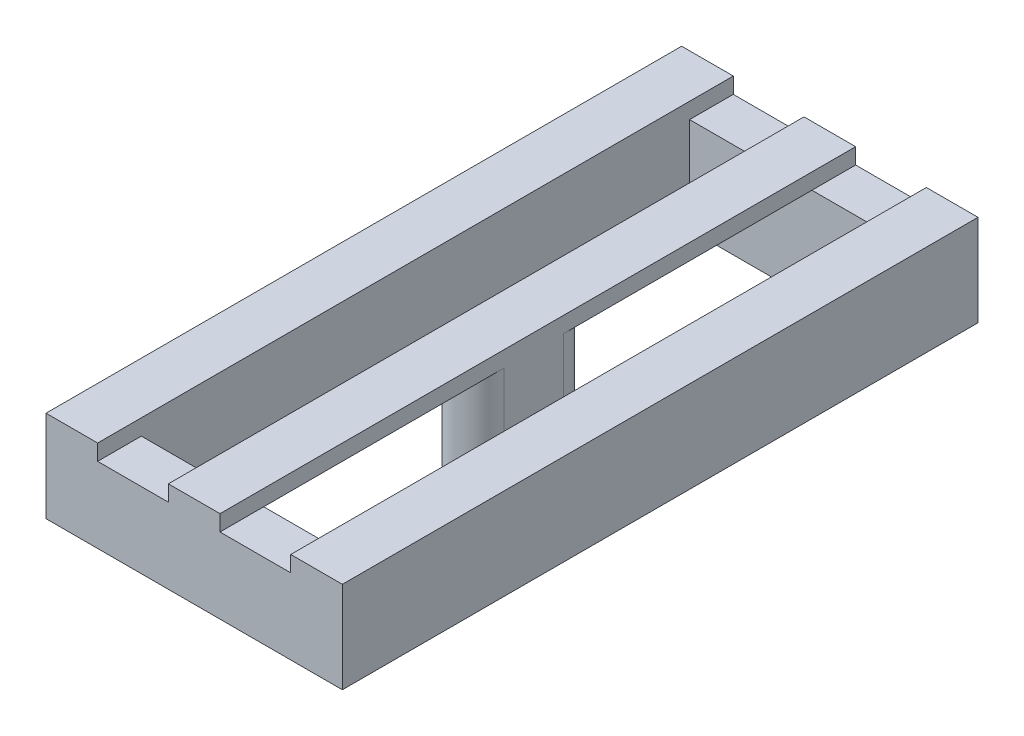
ISO-10303-21;
HEADER;
FILE_DESCRIPTION(('STEP AP214'),'2;1');
FILE_NAME('part.step','',(''),(''),'','','');
FILE_SCHEMA(('AUTOMOTIVE_DESIGN { 1 0 10303 214 1 1 1 1 }'));
ENDSEC;
DATA;
#1=APPLICATION_CONTEXT('core data for automotive mechanical design processes');
#2=APPLICATION_PROTOCOL_DEFINITION('international standard','automotive_design',2000,#1);
#3=PRODUCT_CONTEXT('',#1,'mechanical');
#4=PRODUCT('Part','Part','',(#3));
#5=PRODUCT_RELATED_PRODUCT_CATEGORY('part','',(#4));
#6=PRODUCT_DEFINITION_FORMATION('','',#4);
#7=PRODUCT_DEFINITION_CONTEXT('part definition',#1,'design');
#8=PRODUCT_DEFINITION('design','',#6,#7);
#9=PRODUCT_DEFINITION_SHAPE('','',#8);
#10=(LENGTH_UNIT() NAMED_UNIT(*) SI_UNIT(.MILLI.,.METRE.));
#11=(NAMED_UNIT(*) PLANE_ANGLE_UNIT() SI_UNIT($,.RADIAN.));
#12=(NAMED_UNIT(*) SI_UNIT($,.STERADIAN.) SOLID_ANGLE_UNIT());
#13=UNCERTAINTY_MEASURE_WITH_UNIT(LENGTH_MEASURE(1.E-05),#10,'distance_accuracy_value','');
#14=(GEOMETRIC_REPRESENTATION_CONTEXT(3) GLOBAL_UNCERTAINTY_ASSIGNED_CONTEXT((#13)) GLOBAL_UNIT_ASSIGNED_CONTEXT((#10,
#11,#12)) REPRESENTATION_CONTEXT('',''));
#15=CARTESIAN_POINT('',(0.,0.,0.));
#16=DIRECTION('',(0.,0.,1.));
#17=DIRECTION('',(1.,0.,0.));
#18=AXIS2_PLACEMENT_3D('',#15,#16,#17);
#19=CARTESIAN_POINT('',(0.,-0.6,-7.15));
#20=DIRECTION('',(0.,1.,0.));
#21=DIRECTION('',(-1.,0.,0.));
#22=AXIS2_PLACEMENT_3D('',#19,#20,#21);
#23=CYLINDRICAL_SURFACE('',#22,0.65);
#24=CARTESIAN_POINT('',(0.,1.9,-7.15));
#25=DIRECTION('',(0.,1.,0.));
#26=DIRECTION('',(0.,0.,1.));
#27=AXIS2_PLACEMENT_3D('',#24,#25,#26);
#28=CIRCLE('',#27,0.65);
#29=CARTESIAN_POINT('',(-0.65,1.9,-7.15));
#30=VERTEX_POINT('',#29);
#31=CARTESIAN_POINT('',(0.65,1.9,-7.15));
#32=VERTEX_POINT('',#31);
#33=EDGE_CURVE('E54',#30,#32,#28,.T.);
#34=ORIENTED_EDGE('',*,*,#33,.F.);
#35=DIRECTION('',(0.,1.,0.));
#36=VECTOR('',#35,1.);
#37=CARTESIAN_POINT('',(-0.65,-0.6,-7.15));
#38=LINE('',#37,#36);
#39=CARTESIAN_POINT('',(-0.65,-0.5,-7.15));
#40=VERTEX_POINT('',#39);
#41=EDGE_CURVE('E47',#40,#30,#38,.T.);
#42=ORIENTED_EDGE('',*,*,#41,.F.);
#43=CARTESIAN_POINT('',(0.,-0.5,-7.15));
#44=DIRECTION('',(0.,-1.,0.));
#45=DIRECTION('',(1.,0.,0.));
#46=AXIS2_PLACEMENT_3D('',#43,#44,#45);
#47=CIRCLE('',#46,0.65);
#48=CARTESIAN_POINT('',(0.65,-0.5,-7.15));
#49=VERTEX_POINT('',#48);
#50=EDGE_CURVE('E457',#49,#40,#47,.T.);
#51=ORIENTED_EDGE('',*,*,#50,.F.);
#52=DIRECTION('',(0.,1.,0.));
#53=VECTOR('',#52,1.);
#54=CARTESIAN_POINT('',(0.65,-0.6,-7.15));
#55=LINE('',#54,#53);
#56=EDGE_CURVE('E11',#49,#32,#55,.T.);
#57=ORIENTED_EDGE('',*,*,#56,.T.);
#58=EDGE_LOOP('',(#34,#42,#51,#57));
#59=FACE_BOUND('',#58,.T.);
#60=ADVANCED_FACE('F38',(#59),#23,.T.);
#61=CARTESIAN_POINT('',(0.,-0.6,-8.65));
#62=DIRECTION('',(0.,1.,0.));
#63=DIRECTION('',(-1.,0.,0.));
#64=AXIS2_PLACEMENT_3D('',#61,#62,#63);
#65=CYLINDRICAL_SURFACE('',#64,0.65);
#66=DIRECTION('',(0.,1.,0.));
#67=VECTOR('',#66,1.);
#68=CARTESIAN_POINT('',(-0.65,-0.6,-8.65));
#69=LINE('',#68,#67);
#70=CARTESIAN_POINT('',(-0.65,-0.5,-8.65));
#71=VERTEX_POINT('',#70);
#72=CARTESIAN_POINT('',(-0.65,1.9,-8.65));
#73=VERTEX_POINT('',#72);
#74=EDGE_CURVE('E467',#71,#73,#69,.T.);
#75=ORIENTED_EDGE('',*,*,#74,.T.);
#76=CARTESIAN_POINT('',(0.,1.9,-8.65));
#77=DIRECTION('',(0.,1.,0.));
#78=DIRECTION('',(0.,0.,1.));
#79=AXIS2_PLACEMENT_3D('',#76,#77,#78);
#80=CIRCLE('',#79,0.65);
#81=CARTESIAN_POINT('',(0.65,1.9,-8.65));
#82=VERTEX_POINT('',#81);
#83=EDGE_CURVE('E448',#73,#82,#80,.F.);
#84=ORIENTED_EDGE('',*,*,#83,.T.);
#85=DIRECTION('',(0.,1.,0.));
#86=VECTOR('',#85,1.);
#87=CARTESIAN_POINT('',(0.65,-0.6,-8.65));
#88=LINE('',#87,#86);
#89=CARTESIAN_POINT('',(0.65,-0.5,-8.65));
#90=VERTEX_POINT('',#89);
#91=EDGE_CURVE('E42',#90,#82,#88,.T.);
#92=ORIENTED_EDGE('',*,*,#91,.F.);
#93=CARTESIAN_POINT('',(0.,-0.5,-8.65));
#94=DIRECTION('',(0.,1.,0.));
#95=DIRECTION('',(1.,0.,0.));
#96=AXIS2_PLACEMENT_3D('',#93,#94,#95);
#97=CIRCLE('',#96,0.65);
#98=EDGE_CURVE('E460',#90,#71,#97,.T.);
#99=ORIENTED_EDGE('',*,*,#98,.T.);
#100=EDGE_LOOP('',(#75,#84,#92,#99));
#101=FACE_BOUND('',#100,.T.);
#102=ADVANCED_FACE('F477',(#101),#65,.T.);
#103=CARTESIAN_POINT('',(0.,-0.5,0.));
#104=DIRECTION('',(0.,1.,0.));
#105=DIRECTION('',(-1.,0.,0.));
#106=AXIS2_PLACEMENT_3D('',#103,#104,#105);
#107=PLANE('',#106);
#108=ORIENTED_EDGE('',*,*,#50,.T.);
#109=DIRECTION('',(0.,0.,-1.));
#110=VECTOR('',#109,1.);
#111=CARTESIAN_POINT('',(-0.65,-0.5,0.));
#112=LINE('',#111,#110);
#113=EDGE_CURVE('E465',#40,#71,#112,.T.);
#114=ORIENTED_EDGE('',*,*,#113,.T.);
#115=ORIENTED_EDGE('',*,*,#98,.F.);
#116=DIRECTION('',(0.,0.,-1.));
#117=VECTOR('',#116,1.);
#118=CARTESIAN_POINT('',(0.65,-0.5,0.));
#119=LINE('',#118,#117);
#120=EDGE_CURVE('E463',#49,#90,#119,.T.);
#121=ORIENTED_EDGE('',*,*,#120,.F.);
#122=EDGE_LOOP('',(#108,#114,#115,#121));
#123=FACE_BOUND('',#122,.T.);
#124=ADVANCED_FACE('F479',(#123),#107,.F.);
#125=CARTESIAN_POINT('',(-0.650000000000001,3.1,-16.));
#126=DIRECTION('',(-1.,0.,0.));
#127=DIRECTION('',(0.,-1.,0.));
#128=AXIS2_PLACEMENT_3D('',#125,#126,#127);
#129=PLANE('',#128);
#130=DIRECTION('',(0.,0.,1.));
#131=VECTOR('',#130,1.);
#132=CARTESIAN_POINT('',(-0.65,2.3,-16.));
#133=LINE('',#132,#131);
#134=CARTESIAN_POINT('',(-0.650000000000001,2.3,-16.));
#135=VERTEX_POINT('',#134);
#136=CARTESIAN_POINT('',(-0.65,2.3,0.));
#137=VERTEX_POINT('',#136);
#138=EDGE_CURVE('E257',#135,#137,#133,.T.);
#139=ORIENTED_EDGE('',*,*,#138,.F.);
#140=DIRECTION('',(0.,-1.,0.));
#141=VECTOR('',#140,1.);
#142=CARTESIAN_POINT('',(-0.650000000000001,3.1,-16.));
#143=LINE('',#142,#141);
#144=CARTESIAN_POINT('',(-0.65,1.9,-16.));
#145=VERTEX_POINT('',#144);
#146=EDGE_CURVE('E316',#135,#145,#143,.T.);
#147=ORIENTED_EDGE('',*,*,#146,.T.);
#148=DIRECTION('',(0.,0.,1.));
#149=VECTOR('',#148,1.);
#150=CARTESIAN_POINT('',(-0.65,1.9,-16.));
#151=LINE('',#150,#149);
#152=CARTESIAN_POINT('',(-0.65,1.9,-14.9));
#153=VERTEX_POINT('',#152);
#154=EDGE_CURVE('E318',#145,#153,#151,.T.);
#155=ORIENTED_EDGE('',*,*,#154,.T.);
#156=DIRECTION('',(0.,0.,1.));
#157=VECTOR('',#156,1.);
#158=CARTESIAN_POINT('',(-0.65,1.9,-16.2601470508735));
#159=LINE('',#158,#157);
#160=EDGE_CURVE('E449',#153,#73,#159,.T.);
#161=ORIENTED_EDGE('',*,*,#160,.T.);
#162=ORIENTED_EDGE('',*,*,#74,.F.);
#163=ORIENTED_EDGE('',*,*,#113,.F.);
#164=ORIENTED_EDGE('',*,*,#41,.T.);
#165=CARTESIAN_POINT('',(-0.65,1.9,-1.1));
#166=VERTEX_POINT('',#165);
#167=EDGE_CURVE('E443',#30,#166,#159,.T.);
#168=ORIENTED_EDGE('',*,*,#167,.T.);
#169=CARTESIAN_POINT('',(-0.65,1.9,0.));
#170=VERTEX_POINT('',#169);
#171=EDGE_CURVE('E285',#166,#170,#151,.T.);
#172=ORIENTED_EDGE('',*,*,#171,.T.);
#173=DIRECTION('',(0.,-1.,0.));
#174=VECTOR('',#173,1.);
#175=CARTESIAN_POINT('',(-0.650000000000001,3.1,0.));
#176=LINE('',#175,#174);
#177=EDGE_CURVE('E273',#137,#170,#176,.T.);
#178=ORIENTED_EDGE('',*,*,#177,.F.);
#179=EDGE_LOOP('',(#139,#147,#155,#161,#162,#163,#164,#168,#172,#178));
#180=FACE_BOUND('',#179,.T.);
#181=ADVANCED_FACE('F282',(#180),#129,.T.);
#182=CARTESIAN_POINT('',(0.65,1.9,-16.));
#183=DIRECTION('',(1.,0.,0.));
#184=DIRECTION('',(0.,0.,-1.));
#185=AXIS2_PLACEMENT_3D('',#182,#183,#184);
#186=PLANE('',#185);
#187=DIRECTION('',(0.,0.,-1.));
#188=VECTOR('',#187,1.);
#189=CARTESIAN_POINT('',(0.65,2.3,-16.));
#190=LINE('',#189,#188);
#191=CARTESIAN_POINT('',(0.649999999999998,2.3,0.));
#192=VERTEX_POINT('',#191);
#193=CARTESIAN_POINT('',(0.649999999999998,2.3,-16.));
#194=VERTEX_POINT('',#193);
#195=EDGE_CURVE('E267',#192,#194,#190,.T.);
#196=ORIENTED_EDGE('',*,*,#195,.F.);
#197=DIRECTION('',(0.,1.,0.));
#198=VECTOR('',#197,1.);
#199=CARTESIAN_POINT('',(0.65,1.9,0.));
#200=LINE('',#199,#198);
#201=CARTESIAN_POINT('',(0.65,1.9,0.));
#202=VERTEX_POINT('',#201);
#203=EDGE_CURVE('E277',#202,#192,#200,.T.);
#204=ORIENTED_EDGE('',*,*,#203,.F.);
#205=DIRECTION('',(0.,0.,1.));
#206=VECTOR('',#205,1.);
#207=CARTESIAN_POINT('',(0.65,1.9,-16.));
#208=LINE('',#207,#206);
#209=CARTESIAN_POINT('',(0.65,1.9,-1.1));
#210=VERTEX_POINT('',#209);
#211=EDGE_CURVE('E343',#210,#202,#208,.T.);
#212=ORIENTED_EDGE('',*,*,#211,.F.);
#213=DIRECTION('',(0.,0.,1.));
#214=VECTOR('',#213,1.);
#215=CARTESIAN_POINT('',(0.65,1.9,-16.2601470508735));
#216=LINE('',#215,#214);
#217=EDGE_CURVE('E437',#32,#210,#216,.T.);
#218=ORIENTED_EDGE('',*,*,#217,.F.);
#219=ORIENTED_EDGE('',*,*,#56,.F.);
#220=ORIENTED_EDGE('',*,*,#120,.T.);
#221=ORIENTED_EDGE('',*,*,#91,.T.);
#222=CARTESIAN_POINT('',(0.65,1.9,-14.9));
#223=VERTEX_POINT('',#222);
#224=EDGE_CURVE('E444',#223,#82,#216,.T.);
#225=ORIENTED_EDGE('',*,*,#224,.F.);
#226=CARTESIAN_POINT('',(0.65,1.9,-16.));
#227=VERTEX_POINT('',#226);
#228=EDGE_CURVE('E326',#227,#223,#208,.T.);
#229=ORIENTED_EDGE('',*,*,#228,.F.);
#230=DIRECTION('',(0.,1.,0.));
#231=VECTOR('',#230,1.);
#232=CARTESIAN_POINT('',(0.65,1.9,-16.));
#233=LINE('',#232,#231);
#234=EDGE_CURVE('E319',#227,#194,#233,.T.);
#235=ORIENTED_EDGE('',*,*,#234,.T.);
#236=EDGE_LOOP('',(#196,#204,#212,#218,#219,#220,#221,#225,#229,#235));
#237=FACE_BOUND('',#236,.T.);
#238=ADVANCED_FACE('F40',(#237),#186,.T.);
#239=CARTESIAN_POINT('',(-3.73,2.3,-16.));
#240=DIRECTION('',(0.,-1.,0.));
#241=DIRECTION('',(0.,0.,-1.));
#242=AXIS2_PLACEMENT_3D('',#239,#240,#241);
#243=PLANE('',#242);
#244=ORIENTED_EDGE('',*,*,#195,.T.);
#245=DIRECTION('',(1.,0.,0.));
#246=VECTOR('',#245,1.);
#247=CARTESIAN_POINT('',(-3.73,2.3,-16.));
#248=LINE('',#247,#246);
#249=EDGE_CURVE('E263',#135,#194,#248,.T.);
#250=ORIENTED_EDGE('',*,*,#249,.F.);
#251=ORIENTED_EDGE('',*,*,#138,.T.);
#252=DIRECTION('',(1.,0.,0.));
#253=VECTOR('',#252,1.);
#254=CARTESIAN_POINT('',(-3.73,2.3,0.));
#255=LINE('',#254,#253);
#256=EDGE_CURVE('E260',#137,#192,#255,.T.);
#257=ORIENTED_EDGE('',*,*,#256,.T.);
#258=EDGE_LOOP('',(#244,#250,#251,#257));
#259=FACE_BOUND('',#258,.T.);
#260=ADVANCED_FACE('F259',(#259),#243,.F.);
#261=CARTESIAN_POINT('',(-0.65,1.9,-16.2601470508735));
#262=DIRECTION('',(0.,1.,0.));
#263=DIRECTION('',(0.,0.,1.));
#264=AXIS2_PLACEMENT_3D('',#261,#262,#263);
#265=PLANE('',#264);
#266=ORIENTED_EDGE('',*,*,#83,.F.);
#267=ORIENTED_EDGE('',*,*,#160,.F.);
#268=DIRECTION('',(-1.,0.,0.));
#269=VECTOR('',#268,1.);
#270=CARTESIAN_POINT('',(-0.65,1.9,-14.9));
#271=LINE('',#270,#269);
#272=EDGE_CURVE('E445',#223,#153,#271,.T.);
#273=ORIENTED_EDGE('',*,*,#272,.F.);
#274=ORIENTED_EDGE('',*,*,#224,.T.);
#275=EDGE_LOOP('',(#266,#267,#273,#274));
#276=FACE_BOUND('',#275,.T.);
#277=ADVANCED_FACE('F484',(#276),#265,.F.);
#278=ORIENTED_EDGE('',*,*,#167,.F.);
#279=ORIENTED_EDGE('',*,*,#33,.T.);
#280=ORIENTED_EDGE('',*,*,#217,.T.);
#281=DIRECTION('',(-1.,0.,0.));
#282=VECTOR('',#281,1.);
#283=CARTESIAN_POINT('',(-0.65,1.9,-1.1));
#284=LINE('',#283,#282);
#285=EDGE_CURVE('E440',#210,#166,#284,.T.);
#286=ORIENTED_EDGE('',*,*,#285,.T.);
#287=EDGE_LOOP('',(#278,#279,#280,#286));
#288=FACE_BOUND('',#287,.T.);
#289=ADVANCED_FACE('F550',(#288),#265,.F.);
#290=CARTESIAN_POINT('',(2.43,0.,-14.9));
#291=DIRECTION('',(0.,0.,-1.));
#292=DIRECTION('',(-1.,0.,0.));
#293=AXIS2_PLACEMENT_3D('',#290,#291,#292);
#294=PLANE('',#293);
#295=DIRECTION('',(-1.,0.,0.));
#296=VECTOR('',#295,1.);
#297=CARTESIAN_POINT('',(2.43,1.9,-14.9));
#298=LINE('',#297,#296);
#299=CARTESIAN_POINT('',(2.43,1.9,-14.9));
#300=VERTEX_POINT('',#299);
#301=EDGE_CURVE('E351',#300,#223,#298,.T.);
#302=ORIENTED_EDGE('',*,*,#301,.T.);
#303=ORIENTED_EDGE('',*,*,#272,.T.);
#304=DIRECTION('',(1.,0.,0.));
#305=VECTOR('',#304,1.);
#306=CARTESIAN_POINT('',(-2.43,1.9,-14.9));
#307=LINE('',#306,#305);
#308=CARTESIAN_POINT('',(-2.43,1.9,-14.9));
#309=VERTEX_POINT('',#308);
#310=EDGE_CURVE('E315',#309,#153,#307,.T.);
#311=ORIENTED_EDGE('',*,*,#310,.F.);
#312=DIRECTION('',(0.,1.,0.));
#313=VECTOR('',#312,1.);
#314=CARTESIAN_POINT('',(-2.43,0.,-14.9));
#315=LINE('',#314,#313);
#316=CARTESIAN_POINT('',(-2.43,-0.5,-14.9));
#317=VERTEX_POINT('',#316);
#318=EDGE_CURVE('E310',#317,#309,#315,.T.);
#319=ORIENTED_EDGE('',*,*,#318,.F.);
#320=DIRECTION('',(-1.,0.,0.));
#321=VECTOR('',#320,1.);
#322=CARTESIAN_POINT('',(0.,-0.5,-14.9));
#323=LINE('',#322,#321);
#324=CARTESIAN_POINT('',(2.43,-0.5,-14.9));
#325=VERTEX_POINT('',#324);
#326=EDGE_CURVE('E426',#325,#317,#323,.T.);
#327=ORIENTED_EDGE('',*,*,#326,.F.);
#328=DIRECTION('',(0.,1.,0.));
#329=VECTOR('',#328,1.);
#330=CARTESIAN_POINT('',(2.43,0.,-14.9));
#331=LINE('',#330,#329);
#332=EDGE_CURVE('E349',#325,#300,#331,.T.);
#333=ORIENTED_EDGE('',*,*,#332,.T.);
#334=EDGE_LOOP('',(#302,#303,#311,#319,#327,#333));
#335=FACE_BOUND('',#334,.T.);
#336=ADVANCED_FACE('F487',(#335),#294,.F.);
#337=CARTESIAN_POINT('',(0.65,0.,-1.1));
#338=DIRECTION('',(0.,0.,1.));
#339=DIRECTION('',(1.,0.,0.));
#340=AXIS2_PLACEMENT_3D('',#337,#338,#339);
#341=PLANE('',#340);
#342=DIRECTION('',(-1.,0.,0.));
#343=VECTOR('',#342,1.);
#344=CARTESIAN_POINT('',(-0.649999999999999,1.9,-1.1));
#345=LINE('',#344,#343);
#346=CARTESIAN_POINT('',(-2.43,1.9,-1.1));
#347=VERTEX_POINT('',#346);
#348=EDGE_CURVE('E362',#166,#347,#345,.T.);
#349=ORIENTED_EDGE('',*,*,#348,.F.);
#350=ORIENTED_EDGE('',*,*,#285,.F.);
#351=DIRECTION('',(1.,0.,0.));
#352=VECTOR('',#351,1.);
#353=CARTESIAN_POINT('',(0.649999999999999,1.9,-1.1));
#354=LINE('',#353,#352);
#355=CARTESIAN_POINT('',(2.43,1.9,-1.1));
#356=VERTEX_POINT('',#355);
#357=EDGE_CURVE('E355',#210,#356,#354,.T.);
#358=ORIENTED_EDGE('',*,*,#357,.T.);
#359=DIRECTION('',(0.,1.,0.));
#360=VECTOR('',#359,1.);
#361=CARTESIAN_POINT('',(2.43,0.,-1.1));
#362=LINE('',#361,#360);
#363=CARTESIAN_POINT('',(2.43,-0.5,-1.1));
#364=VERTEX_POINT('',#363);
#365=EDGE_CURVE('E344',#364,#356,#362,.T.);
#366=ORIENTED_EDGE('',*,*,#365,.F.);
#367=DIRECTION('',(-1.,0.,0.));
#368=VECTOR('',#367,1.);
#369=CARTESIAN_POINT('',(0.,-0.5,-1.1));
#370=LINE('',#369,#368);
#371=CARTESIAN_POINT('',(0.65,-0.5,-1.1));
#372=VERTEX_POINT('',#371);
#373=EDGE_CURVE('E357',#364,#372,#370,.T.);
#374=ORIENTED_EDGE('',*,*,#373,.T.);
#375=DIRECTION('',(0.,1.,0.));
#376=VECTOR('',#375,1.);
#377=CARTESIAN_POINT('',(0.65,-0.600000000000001,-1.1));
#378=LINE('',#377,#376);
#379=CARTESIAN_POINT('',(0.65,0.5,-1.1));
#380=VERTEX_POINT('',#379);
#381=EDGE_CURVE('E363',#372,#380,#378,.T.);
#382=ORIENTED_EDGE('',*,*,#381,.T.);
#383=DIRECTION('',(1.,0.,0.));
#384=VECTOR('',#383,1.);
#385=CARTESIAN_POINT('',(0.65,0.5,-1.1));
#386=LINE('',#385,#384);
#387=CARTESIAN_POINT('',(-0.65,0.5,-1.1));
#388=VERTEX_POINT('',#387);
#389=EDGE_CURVE('E407',#388,#380,#386,.T.);
#390=ORIENTED_EDGE('',*,*,#389,.F.);
#391=DIRECTION('',(0.,1.,0.));
#392=VECTOR('',#391,1.);
#393=CARTESIAN_POINT('',(-0.65,-0.600000000000001,-1.1));
#394=LINE('',#393,#392);
#395=CARTESIAN_POINT('',(-0.65,-0.5,-1.1));
#396=VERTEX_POINT('',#395);
#397=EDGE_CURVE('E402',#396,#388,#394,.T.);
#398=ORIENTED_EDGE('',*,*,#397,.F.);
#399=DIRECTION('',(1.,0.,0.));
#400=VECTOR('',#399,1.);
#401=CARTESIAN_POINT('',(0.,-0.5,-1.1));
#402=LINE('',#401,#400);
#403=CARTESIAN_POINT('',(-2.43,-0.5,-1.1));
#404=VERTEX_POINT('',#403);
#405=EDGE_CURVE('E358',#404,#396,#402,.T.);
#406=ORIENTED_EDGE('',*,*,#405,.F.);
#407=DIRECTION('',(0.,1.,0.));
#408=VECTOR('',#407,1.);
#409=CARTESIAN_POINT('',(-2.43,0.,-1.1));
#410=LINE('',#409,#408);
#411=EDGE_CURVE('E360',#404,#347,#410,.T.);
#412=ORIENTED_EDGE('',*,*,#411,.T.);
#413=EDGE_LOOP('',(#349,#350,#358,#366,#374,#382,#390,#398,#406,#412));
#414=FACE_BOUND('',#413,.T.);
#415=ADVANCED_FACE('F547',(#414),#341,.F.);
#416=CARTESIAN_POINT('',(0.,-0.5,0.));
#417=DIRECTION('',(0.,1.,0.));
#418=DIRECTION('',(-1.,0.,0.));
#419=AXIS2_PLACEMENT_3D('',#416,#417,#418);
#420=PLANE('',#419);
#421=DIRECTION('',(-1.,0.,0.));
#422=VECTOR('',#421,1.);
#423=CARTESIAN_POINT('',(-3.23,-0.500000000000001,-0.5));
#424=LINE('',#423,#422);
#425=CARTESIAN_POINT('',(2.93,-0.499999999999999,-0.5));
#426=VERTEX_POINT('',#425);
#427=CARTESIAN_POINT('',(-2.93,-0.5,-0.5));
#428=VERTEX_POINT('',#427);
#429=EDGE_CURVE('E322',#426,#428,#424,.T.);
#430=ORIENTED_EDGE('',*,*,#429,.T.);
#431=CARTESIAN_POINT('',(-2.93,-0.500000000000001,-0.8));
#432=DIRECTION('',(0.,1.,0.));
#433=DIRECTION('',(-1.,0.,0.));
#434=AXIS2_PLACEMENT_3D('',#431,#432,#433);
#435=CIRCLE('',#434,0.3);
#436=CARTESIAN_POINT('',(-3.23,-0.500000000000001,-0.8));
#437=VERTEX_POINT('',#436);
#438=EDGE_CURVE('E399',#428,#437,#435,.F.);
#439=ORIENTED_EDGE('',*,*,#438,.T.);
#440=DIRECTION('',(0.,0.,-1.));
#441=VECTOR('',#440,1.);
#442=CARTESIAN_POINT('',(-3.23,-0.500000000000001,-15.5));
#443=LINE('',#442,#441);
#444=CARTESIAN_POINT('',(-3.23,-0.500000000000001,-15.2));
#445=VERTEX_POINT('',#444);
#446=EDGE_CURVE('E396',#437,#445,#443,.T.);
#447=ORIENTED_EDGE('',*,*,#446,.T.);
#448=CARTESIAN_POINT('',(-2.93,-0.500000000000001,-15.2));
#449=DIRECTION('',(0.,1.,0.));
#450=DIRECTION('',(-1.,0.,0.));
#451=AXIS2_PLACEMENT_3D('',#448,#449,#450);
#452=CIRCLE('',#451,0.3);
#453=CARTESIAN_POINT('',(-2.93,-0.500000000000001,-15.5));
#454=VERTEX_POINT('',#453);
#455=EDGE_CURVE('E395',#445,#454,#452,.F.);
#456=ORIENTED_EDGE('',*,*,#455,.T.);
#457=DIRECTION('',(1.,0.,0.));
#458=VECTOR('',#457,1.);
#459=CARTESIAN_POINT('',(3.23,-0.499999999999999,-15.5));
#460=LINE('',#459,#458);
#461=CARTESIAN_POINT('',(2.93,-0.5,-15.5));
#462=VERTEX_POINT('',#461);
#463=EDGE_CURVE('E392',#454,#462,#460,.T.);
#464=ORIENTED_EDGE('',*,*,#463,.T.);
#465=CARTESIAN_POINT('',(2.93,-0.499999999999999,-15.2));
#466=DIRECTION('',(0.,1.,0.));
#467=DIRECTION('',(-1.,0.,0.));
#468=AXIS2_PLACEMENT_3D('',#465,#466,#467);
#469=CIRCLE('',#468,0.3);
#470=CARTESIAN_POINT('',(3.23,-0.499999999999999,-15.2));
#471=VERTEX_POINT('',#470);
#472=EDGE_CURVE('E391',#462,#471,#469,.F.);
#473=ORIENTED_EDGE('',*,*,#472,.T.);
#474=DIRECTION('',(0.,0.,1.));
#475=VECTOR('',#474,1.);
#476=CARTESIAN_POINT('',(3.23,-0.499999999999999,-0.5));
#477=LINE('',#476,#475);
#478=CARTESIAN_POINT('',(3.23,-0.499999999999999,-0.8));
#479=VERTEX_POINT('',#478);
#480=EDGE_CURVE('E387',#471,#479,#477,.T.);
#481=ORIENTED_EDGE('',*,*,#480,.T.);
#482=CARTESIAN_POINT('',(2.93,-0.499999999999999,-0.8));
#483=DIRECTION('',(0.,1.,0.));
#484=DIRECTION('',(-1.,0.,0.));
#485=AXIS2_PLACEMENT_3D('',#482,#483,#484);
#486=CIRCLE('',#485,0.3);
#487=EDGE_CURVE('E390',#479,#426,#486,.F.);
#488=ORIENTED_EDGE('',*,*,#487,.T.);
#489=EDGE_LOOP('',(#430,#439,#447,#456,#464,#473,#481,#488));
#490=FACE_BOUND('',#489,.T.);
#491=DIRECTION('',(0.,0.,1.));
#492=VECTOR('',#491,1.);
#493=CARTESIAN_POINT('',(-0.65,-0.5,-0.900000000000001));
#494=LINE('',#493,#492);
#495=CARTESIAN_POINT('',(-0.65,-0.5,-0.900000000000001));
#496=VERTEX_POINT('',#495);
#497=EDGE_CURVE('E417',#396,#496,#494,.T.);
#498=ORIENTED_EDGE('',*,*,#497,.T.);
#499=DIRECTION('',(1.,0.,0.));
#500=VECTOR('',#499,1.);
#501=CARTESIAN_POINT('',(-0.65,-0.5,-0.900000000000001));
#502=LINE('',#501,#500);
#503=CARTESIAN_POINT('',(0.65,-0.5,-0.900000000000001));
#504=VERTEX_POINT('',#503);
#505=EDGE_CURVE('E420',#496,#504,#502,.T.);
#506=ORIENTED_EDGE('',*,*,#505,.T.);
#507=DIRECTION('',(0.,0.,-1.));
#508=VECTOR('',#507,1.);
#509=CARTESIAN_POINT('',(0.65,-0.5,-0.900000000000001));
#510=LINE('',#509,#508);
#511=EDGE_CURVE('E423',#504,#372,#510,.T.);
#512=ORIENTED_EDGE('',*,*,#511,.T.);
#513=ORIENTED_EDGE('',*,*,#373,.F.);
#514=DIRECTION('',(0.,0.,1.));
#515=VECTOR('',#514,1.);
#516=CARTESIAN_POINT('',(2.43,-0.5,0.));
#517=LINE('',#516,#515);
#518=EDGE_CURVE('E348',#325,#364,#517,.T.);
#519=ORIENTED_EDGE('',*,*,#518,.F.);
#520=ORIENTED_EDGE('',*,*,#326,.T.);
#521=DIRECTION('',(0.,0.,1.));
#522=VECTOR('',#521,1.);
#523=CARTESIAN_POINT('',(-2.43,-0.5,0.));
#524=LINE('',#523,#522);
#525=EDGE_CURVE('E947',#317,#404,#524,.T.);
#526=ORIENTED_EDGE('',*,*,#525,.T.);
#527=ORIENTED_EDGE('',*,*,#405,.T.);
#528=EDGE_LOOP('',(#498,#506,#512,#513,#519,#520,#526,#527));
#529=FACE_BOUND('',#528,.T.);
#530=ADVANCED_FACE('F596',(#490,#529),#420,.F.);
#531=CARTESIAN_POINT('',(-0.65,1.9,-16.));
#532=DIRECTION('',(0.,1.,0.));
#533=DIRECTION('',(0.,0.,1.));
#534=AXIS2_PLACEMENT_3D('',#531,#532,#533);
#535=PLANE('',#534);
#536=ORIENTED_EDGE('',*,*,#171,.F.);
#537=ORIENTED_EDGE('',*,*,#348,.T.);
#538=DIRECTION('',(0.,0.,1.));
#539=VECTOR('',#538,1.);
#540=CARTESIAN_POINT('',(-2.43,1.9,-16.));
#541=LINE('',#540,#539);
#542=CARTESIAN_POINT('',(-2.43,1.9,0.));
#543=VERTEX_POINT('',#542);
#544=EDGE_CURVE('E369',#347,#543,#541,.T.);
#545=ORIENTED_EDGE('',*,*,#544,.T.);
#546=DIRECTION('',(-1.,0.,0.));
#547=VECTOR('',#546,1.);
#548=CARTESIAN_POINT('',(-0.65,1.9,0.));
#549=LINE('',#548,#547);
#550=EDGE_CURVE('E287',#170,#543,#549,.T.);
#551=ORIENTED_EDGE('',*,*,#550,.F.);
#552=EDGE_LOOP('',(#536,#537,#545,#551));
#553=FACE_BOUND('',#552,.T.);
#554=ADVANCED_FACE('F607',(#553),#535,.T.);
#555=CARTESIAN_POINT('',(-2.43,1.9,-16.));
#556=VERTEX_POINT('',#555);
#557=EDGE_CURVE('E366',#556,#309,#541,.T.);
#558=ORIENTED_EDGE('',*,*,#557,.T.);
#559=ORIENTED_EDGE('',*,*,#310,.T.);
#560=ORIENTED_EDGE('',*,*,#154,.F.);
#561=DIRECTION('',(-1.,0.,0.));
#562=VECTOR('',#561,1.);
#563=CARTESIAN_POINT('',(-0.65,1.9,-16.));
#564=LINE('',#563,#562);
#565=EDGE_CURVE('E311',#145,#556,#564,.T.);
#566=ORIENTED_EDGE('',*,*,#565,.T.);
#567=EDGE_LOOP('',(#558,#559,#560,#566));
#568=FACE_BOUND('',#567,.T.);
#569=ADVANCED_FACE('F492',(#568),#535,.T.);
#570=CARTESIAN_POINT('',(-3.73,0.,-16.));
#571=DIRECTION('',(0.,-1.,0.));
#572=DIRECTION('',(1.,0.,0.));
#573=AXIS2_PLACEMENT_3D('',#570,#571,#572);
#574=PLANE('',#573);
#575=DIRECTION('',(-1.,0.,0.));
#576=VECTOR('',#575,1.);
#577=CARTESIAN_POINT('',(-3.23,0.,-0.5));
#578=LINE('',#577,#576);
#579=CARTESIAN_POINT('',(2.93,0.,-0.5));
#580=VERTEX_POINT('',#579);
#581=CARTESIAN_POINT('',(-2.93,0.,-0.5));
#582=VERTEX_POINT('',#581);
#583=EDGE_CURVE('E354',#580,#582,#578,.T.);
#584=ORIENTED_EDGE('',*,*,#583,.F.);
#585=CARTESIAN_POINT('',(2.93,0.,-0.8));
#586=DIRECTION('',(0.,-1.,0.));
#587=DIRECTION('',(1.,0.,0.));
#588=AXIS2_PLACEMENT_3D('',#585,#586,#587);
#589=CIRCLE('',#588,0.3);
#590=CARTESIAN_POINT('',(3.23,0.,-0.8));
#591=VERTEX_POINT('',#590);
#592=EDGE_CURVE('E314',#580,#591,#589,.F.);
#593=ORIENTED_EDGE('',*,*,#592,.T.);
#594=DIRECTION('',(0.,0.,1.));
#595=VECTOR('',#594,1.);
#596=CARTESIAN_POINT('',(3.23,0.,-0.5));
#597=LINE('',#596,#595);
#598=CARTESIAN_POINT('',(3.23,0.,-15.2));
#599=VERTEX_POINT('',#598);
#600=EDGE_CURVE('E370',#599,#591,#597,.T.);
#601=ORIENTED_EDGE('',*,*,#600,.F.);
#602=CARTESIAN_POINT('',(2.93,0.,-15.2));
#603=DIRECTION('',(0.,-1.,0.));
#604=DIRECTION('',(1.,0.,0.));
#605=AXIS2_PLACEMENT_3D('',#602,#603,#604);
#606=CIRCLE('',#605,0.3);
#607=CARTESIAN_POINT('',(2.93,0.,-15.5));
#608=VERTEX_POINT('',#607);
#609=EDGE_CURVE('E980',#599,#608,#606,.F.);
#610=ORIENTED_EDGE('',*,*,#609,.T.);
#611=DIRECTION('',(1.,0.,0.));
#612=VECTOR('',#611,1.);
#613=CARTESIAN_POINT('',(3.23,0.,-15.5));
#614=LINE('',#613,#612);
#615=CARTESIAN_POINT('',(-2.93,0.,-15.5));
#616=VERTEX_POINT('',#615);
#617=EDGE_CURVE('E375',#616,#608,#614,.T.);
#618=ORIENTED_EDGE('',*,*,#617,.F.);
#619=CARTESIAN_POINT('',(-2.93,0.,-15.2));
#620=DIRECTION('',(0.,-1.,0.));
#621=DIRECTION('',(1.,0.,0.));
#622=AXIS2_PLACEMENT_3D('',#619,#620,#621);
#623=CIRCLE('',#622,0.3);
#624=CARTESIAN_POINT('',(-3.23,0.,-15.2));
#625=VERTEX_POINT('',#624);
#626=EDGE_CURVE('E978',#616,#625,#623,.F.);
#627=ORIENTED_EDGE('',*,*,#626,.T.);
#628=DIRECTION('',(0.,0.,-1.));
#629=VECTOR('',#628,1.);
#630=CARTESIAN_POINT('',(-3.23,0.,-15.5));
#631=LINE('',#630,#629);
#632=CARTESIAN_POINT('',(-3.23,0.,-0.8));
#633=VERTEX_POINT('',#632);
#634=EDGE_CURVE('E380',#633,#625,#631,.T.);
#635=ORIENTED_EDGE('',*,*,#634,.F.);
#636=CARTESIAN_POINT('',(-2.93,0.,-0.8));
#637=DIRECTION('',(0.,-1.,0.));
#638=DIRECTION('',(1.,0.,0.));
#639=AXIS2_PLACEMENT_3D('',#636,#637,#638);
#640=CIRCLE('',#639,0.3);
#641=EDGE_CURVE('E339',#633,#582,#640,.F.);
#642=ORIENTED_EDGE('',*,*,#641,.T.);
#643=EDGE_LOOP('',(#584,#593,#601,#610,#618,#627,#635,#642));
#644=FACE_BOUND('',#643,.T.);
#645=DIRECTION('',(1.,0.,0.));
#646=VECTOR('',#645,1.);
#647=CARTESIAN_POINT('',(-3.73,0.,0.));
#648=LINE('',#647,#646);
#649=CARTESIAN_POINT('',(-3.73,0.,0.));
#650=VERTEX_POINT('',#649);
#651=CARTESIAN_POINT('',(3.73,0.,0.));
#652=VERTEX_POINT('',#651);
#653=EDGE_CURVE('E301',#650,#652,#648,.T.);
#654=ORIENTED_EDGE('',*,*,#653,.F.);
#655=DIRECTION('',(0.,0.,1.));
#656=VECTOR('',#655,1.);
#657=CARTESIAN_POINT('',(-3.73,0.,-16.));
#658=LINE('',#657,#656);
#659=CARTESIAN_POINT('',(-3.73,0.,-16.));
#660=VERTEX_POINT('',#659);
#661=EDGE_CURVE('E342',#660,#650,#658,.T.);
#662=ORIENTED_EDGE('',*,*,#661,.F.);
#663=DIRECTION('',(1.,0.,0.));
#664=VECTOR('',#663,1.);
#665=CARTESIAN_POINT('',(-3.73,0.,-16.));
#666=LINE('',#665,#664);
#667=CARTESIAN_POINT('',(3.73,0.,-16.));
#668=VERTEX_POINT('',#667);
#669=EDGE_CURVE('E335',#660,#668,#666,.T.);
#670=ORIENTED_EDGE('',*,*,#669,.T.);
#671=DIRECTION('',(0.,0.,1.));
#672=VECTOR('',#671,1.);
#673=CARTESIAN_POINT('',(3.73,0.,-16.));
#674=LINE('',#673,#672);
#675=EDGE_CURVE('E338',#668,#652,#674,.T.);
#676=ORIENTED_EDGE('',*,*,#675,.T.);
#677=EDGE_LOOP('',(#654,#662,#670,#676));
#678=FACE_BOUND('',#677,.T.);
#679=ADVANCED_FACE('F519',(#644,#678),#574,.T.);
#680=CARTESIAN_POINT('',(2.43,1.9,-16.));
#681=DIRECTION('',(0.,1.,0.));
#682=DIRECTION('',(-1.,0.,0.));
#683=AXIS2_PLACEMENT_3D('',#680,#681,#682);
#684=PLANE('',#683);
#685=ORIENTED_EDGE('',*,*,#357,.F.);
#686=ORIENTED_EDGE('',*,*,#211,.T.);
#687=DIRECTION('',(-1.,0.,0.));
#688=VECTOR('',#687,1.);
#689=CARTESIAN_POINT('',(2.43,1.9,0.));
#690=LINE('',#689,#688);
#691=CARTESIAN_POINT('',(2.43,1.9,0.));
#692=VERTEX_POINT('',#691);
#693=EDGE_CURVE('E291',#692,#202,#690,.T.);
#694=ORIENTED_EDGE('',*,*,#693,.F.);
#695=DIRECTION('',(0.,0.,1.));
#696=VECTOR('',#695,1.);
#697=CARTESIAN_POINT('',(2.43,1.9,-16.));
#698=LINE('',#697,#696);
#699=EDGE_CURVE('E347',#356,#692,#698,.T.);
#700=ORIENTED_EDGE('',*,*,#699,.F.);
#701=EDGE_LOOP('',(#685,#686,#694,#700));
#702=FACE_BOUND('',#701,.T.);
#703=ADVANCED_FACE('F531',(#702),#684,.T.);
#704=CARTESIAN_POINT('',(-3.73,3.1,-16.));
#705=DIRECTION('',(-1.,0.,0.));
#706=DIRECTION('',(0.,0.,1.));
#707=AXIS2_PLACEMENT_3D('',#704,#705,#706);
#708=PLANE('',#707);
#709=DIRECTION('',(0.,0.,1.));
#710=VECTOR('',#709,1.);
#711=CARTESIAN_POINT('',(-3.73,2.3,-16.));
#712=LINE('',#711,#710);
#713=CARTESIAN_POINT('',(-3.73,2.3,-16.));
#714=VERTEX_POINT('',#713);
#715=CARTESIAN_POINT('',(-3.73,2.3,0.));
#716=VERTEX_POINT('',#715);
#717=EDGE_CURVE('E432',#714,#716,#712,.T.);
#718=ORIENTED_EDGE('',*,*,#717,.F.);
#719=DIRECTION('',(0.,-1.,0.));
#720=VECTOR('',#719,1.);
#721=CARTESIAN_POINT('',(-3.73,3.1,-16.));
#722=LINE('',#721,#720);
#723=EDGE_CURVE('E340',#714,#660,#722,.T.);
#724=ORIENTED_EDGE('',*,*,#723,.T.);
#725=ORIENTED_EDGE('',*,*,#661,.T.);
#726=DIRECTION('',(0.,-1.,0.));
#727=VECTOR('',#726,1.);
#728=CARTESIAN_POINT('',(-3.73,3.1,0.));
#729=LINE('',#728,#727);
#730=EDGE_CURVE('E304',#716,#650,#729,.T.);
#731=ORIENTED_EDGE('',*,*,#730,.F.);
#732=EDGE_LOOP('',(#718,#724,#725,#731));
#733=FACE_BOUND('',#732,.T.);
#734=ADVANCED_FACE('F516',(#733),#708,.T.);
#735=CARTESIAN_POINT('',(-2.43,1.9,-16.));
#736=DIRECTION('',(1.,0.,0.));
#737=DIRECTION('',(0.,0.,-1.));
#738=AXIS2_PLACEMENT_3D('',#735,#736,#737);
#739=PLANE('',#738);
#740=DIRECTION('',(0.,0.,-1.));
#741=VECTOR('',#740,1.);
#742=CARTESIAN_POINT('',(-2.43,2.3,-16.));
#743=LINE('',#742,#741);
#744=CARTESIAN_POINT('',(-2.43,2.3,0.));
#745=VERTEX_POINT('',#744);
#746=CARTESIAN_POINT('',(-2.43,2.3,-16.));
#747=VERTEX_POINT('',#746);
#748=EDGE_CURVE('E278',#745,#747,#743,.T.);
#749=ORIENTED_EDGE('',*,*,#748,.F.);
#750=DIRECTION('',(0.,1.,0.));
#751=VECTOR('',#750,1.);
#752=CARTESIAN_POINT('',(-2.43,1.9,0.));
#753=LINE('',#752,#751);
#754=EDGE_CURVE('E289',#543,#745,#753,.T.);
#755=ORIENTED_EDGE('',*,*,#754,.F.);
#756=ORIENTED_EDGE('',*,*,#544,.F.);
#757=ORIENTED_EDGE('',*,*,#411,.F.);
#758=ORIENTED_EDGE('',*,*,#525,.F.);
#759=ORIENTED_EDGE('',*,*,#318,.T.);
#760=ORIENTED_EDGE('',*,*,#557,.F.);
#761=DIRECTION('',(0.,1.,0.));
#762=VECTOR('',#761,1.);
#763=CARTESIAN_POINT('',(-2.43,1.9,-16.));
#764=LINE('',#763,#762);
#765=EDGE_CURVE('E307',#556,#747,#764,.T.);
#766=ORIENTED_EDGE('',*,*,#765,.T.);
#767=EDGE_LOOP('',(#749,#755,#756,#757,#758,#759,#760,#766));
#768=FACE_BOUND('',#767,.T.);
#769=ADVANCED_FACE('F504',(#768),#739,.T.);
#770=ORIENTED_EDGE('',*,*,#301,.F.);
#771=CARTESIAN_POINT('',(2.43,1.9,-16.));
#772=VERTEX_POINT('',#771);
#773=EDGE_CURVE('E329',#772,#300,#698,.T.);
#774=ORIENTED_EDGE('',*,*,#773,.F.);
#775=DIRECTION('',(-1.,0.,0.));
#776=VECTOR('',#775,1.);
#777=CARTESIAN_POINT('',(2.43,1.9,-16.));
#778=LINE('',#777,#776);
#779=EDGE_CURVE('E323',#772,#227,#778,.T.);
#780=ORIENTED_EDGE('',*,*,#779,.T.);
#781=ORIENTED_EDGE('',*,*,#228,.T.);
#782=EDGE_LOOP('',(#770,#774,#780,#781));
#783=FACE_BOUND('',#782,.T.);
#784=ADVANCED_FACE('F640',(#783),#684,.T.);
#785=CARTESIAN_POINT('',(2.43,3.1,-16.));
#786=DIRECTION('',(-1.,0.,0.));
#787=DIRECTION('',(0.,0.,1.));
#788=AXIS2_PLACEMENT_3D('',#785,#786,#787);
#789=PLANE('',#788);
#790=DIRECTION('',(0.,0.,1.));
#791=VECTOR('',#790,1.);
#792=CARTESIAN_POINT('',(2.43,2.3,-16.));
#793=LINE('',#792,#791);
#794=CARTESIAN_POINT('',(2.43,2.3,-16.));
#795=VERTEX_POINT('',#794);
#796=CARTESIAN_POINT('',(2.43,2.3,0.));
#797=VERTEX_POINT('',#796);
#798=EDGE_CURVE('E413',#795,#797,#793,.T.);
#799=ORIENTED_EDGE('',*,*,#798,.F.);
#800=DIRECTION('',(0.,-1.,0.));
#801=VECTOR('',#800,1.);
#802=CARTESIAN_POINT('',(2.43,3.1,-16.));
#803=LINE('',#802,#801);
#804=EDGE_CURVE('E327',#795,#772,#803,.T.);
#805=ORIENTED_EDGE('',*,*,#804,.T.);
#806=ORIENTED_EDGE('',*,*,#773,.T.);
#807=ORIENTED_EDGE('',*,*,#332,.F.);
#808=ORIENTED_EDGE('',*,*,#518,.T.);
#809=ORIENTED_EDGE('',*,*,#365,.T.);
#810=ORIENTED_EDGE('',*,*,#699,.T.);
#811=DIRECTION('',(0.,-1.,0.));
#812=VECTOR('',#811,1.);
#813=CARTESIAN_POINT('',(2.43,3.1,0.));
#814=LINE('',#813,#812);
#815=EDGE_CURVE('E296',#797,#692,#814,.T.);
#816=ORIENTED_EDGE('',*,*,#815,.F.);
#817=EDGE_LOOP('',(#799,#805,#806,#807,#808,#809,#810,#816));
#818=FACE_BOUND('',#817,.T.);
#819=ADVANCED_FACE('F540',(#818),#789,.T.);
#820=CARTESIAN_POINT('',(3.73,0.,-16.));
#821=DIRECTION('',(1.,0.,0.));
#822=DIRECTION('',(0.,1.,0.));
#823=AXIS2_PLACEMENT_3D('',#820,#821,#822);
#824=PLANE('',#823);
#825=DIRECTION('',(0.,0.,1.));
#826=VECTOR('',#825,1.);
#827=CARTESIAN_POINT('',(3.73,2.3,-16.));
#828=LINE('',#827,#826);
#829=CARTESIAN_POINT('',(3.73,2.3,-16.));
#830=VERTEX_POINT('',#829);
#831=CARTESIAN_POINT('',(3.73,2.3,0.));
#832=VERTEX_POINT('',#831);
#833=EDGE_CURVE('E334',#830,#832,#828,.T.);
#834=ORIENTED_EDGE('',*,*,#833,.T.);
#835=DIRECTION('',(0.,1.,0.));
#836=VECTOR('',#835,1.);
#837=CARTESIAN_POINT('',(3.73,0.,0.));
#838=LINE('',#837,#836);
#839=EDGE_CURVE('E298',#652,#832,#838,.T.);
#840=ORIENTED_EDGE('',*,*,#839,.F.);
#841=ORIENTED_EDGE('',*,*,#675,.F.);
#842=DIRECTION('',(0.,1.,0.));
#843=VECTOR('',#842,1.);
#844=CARTESIAN_POINT('',(3.73,0.,-16.));
#845=LINE('',#844,#843);
#846=EDGE_CURVE('E330',#668,#830,#845,.T.);
#847=ORIENTED_EDGE('',*,*,#846,.T.);
#848=EDGE_LOOP('',(#834,#840,#841,#847));
#849=FACE_BOUND('',#848,.T.);
#850=ADVANCED_FACE('F670',(#849),#824,.T.);
#851=CARTESIAN_POINT('',(0.,0.,-16.));
#852=DIRECTION('',(0.,0.,1.));
#853=DIRECTION('',(1.,0.,0.));
#854=AXIS2_PLACEMENT_3D('',#851,#852,#853);
#855=PLANE('',#854);
#856=ORIENTED_EDGE('',*,*,#723,.F.);
#857=EDGE_CURVE('E333',#714,#747,#248,.T.);
#858=ORIENTED_EDGE('',*,*,#857,.T.);
#859=ORIENTED_EDGE('',*,*,#765,.F.);
#860=ORIENTED_EDGE('',*,*,#565,.F.);
#861=ORIENTED_EDGE('',*,*,#146,.F.);
#862=ORIENTED_EDGE('',*,*,#249,.T.);
#863=ORIENTED_EDGE('',*,*,#234,.F.);
#864=ORIENTED_EDGE('',*,*,#779,.F.);
#865=ORIENTED_EDGE('',*,*,#804,.F.);
#866=EDGE_CURVE('E306',#795,#830,#248,.T.);
#867=ORIENTED_EDGE('',*,*,#866,.T.);
#868=ORIENTED_EDGE('',*,*,#846,.F.);
#869=ORIENTED_EDGE('',*,*,#669,.F.);
#870=EDGE_LOOP('',(#856,#858,#859,#860,#861,#862,#863,#864,#865,#867,#868,#869));
#871=FACE_BOUND('',#870,.T.);
#872=ADVANCED_FACE('F510',(#871),#855,.F.);
#873=CARTESIAN_POINT('',(0.,0.,0.));
#874=DIRECTION('',(0.,0.,1.));
#875=DIRECTION('',(1.,0.,0.));
#876=AXIS2_PLACEMENT_3D('',#873,#874,#875);
#877=PLANE('',#876);
#878=EDGE_CURVE('E281',#716,#745,#255,.T.);
#879=ORIENTED_EDGE('',*,*,#878,.F.);
#880=ORIENTED_EDGE('',*,*,#730,.T.);
#881=ORIENTED_EDGE('',*,*,#653,.T.);
#882=ORIENTED_EDGE('',*,*,#839,.T.);
#883=EDGE_CURVE('E279',#797,#832,#255,.T.);
#884=ORIENTED_EDGE('',*,*,#883,.F.);
#885=ORIENTED_EDGE('',*,*,#815,.T.);
#886=ORIENTED_EDGE('',*,*,#693,.T.);
#887=ORIENTED_EDGE('',*,*,#203,.T.);
#888=ORIENTED_EDGE('',*,*,#256,.F.);
#889=ORIENTED_EDGE('',*,*,#177,.T.);
#890=ORIENTED_EDGE('',*,*,#550,.T.);
#891=ORIENTED_EDGE('',*,*,#754,.T.);
#892=EDGE_LOOP('',(#879,#880,#881,#882,#884,#885,#886,#887,#888,#889,#890,#891));
#893=FACE_BOUND('',#892,.T.);
#894=ADVANCED_FACE('F271',(#893),#877,.T.);
#895=CARTESIAN_POINT('',(-3.23,-0.500000000000001,-0.5));
#896=DIRECTION('',(0.,0.,-1.));
#897=DIRECTION('',(-1.,0.,0.));
#898=AXIS2_PLACEMENT_3D('',#895,#896,#897);
#899=PLANE('',#898);
#900=ORIENTED_EDGE('',*,*,#583,.T.);
#901=DIRECTION('',(0.,1.,0.));
#902=VECTOR('',#901,1.);
#903=CARTESIAN_POINT('',(-2.93,-0.5,-0.5));
#904=LINE('',#903,#902);
#905=EDGE_CURVE('E386',#582,#428,#904,.F.);
#906=ORIENTED_EDGE('',*,*,#905,.T.);
#907=ORIENTED_EDGE('',*,*,#429,.F.);
#908=DIRECTION('',(0.,1.,0.));
#909=VECTOR('',#908,1.);
#910=CARTESIAN_POINT('',(2.93,-0.499999999999999,-0.5));
#911=LINE('',#910,#909);
#912=EDGE_CURVE('E963',#426,#580,#911,.T.);
#913=ORIENTED_EDGE('',*,*,#912,.T.);
#914=EDGE_LOOP('',(#900,#906,#907,#913));
#915=FACE_BOUND('',#914,.T.);
#916=ADVANCED_FACE('F694',(#915),#899,.F.);
#917=CARTESIAN_POINT('',(-3.23,-0.500000000000001,-15.5));
#918=DIRECTION('',(1.,0.,0.));
#919=DIRECTION('',(0.,1.,0.));
#920=AXIS2_PLACEMENT_3D('',#917,#918,#919);
#921=PLANE('',#920);
#922=ORIENTED_EDGE('',*,*,#446,.F.);
#923=DIRECTION('',(0.,1.,0.));
#924=VECTOR('',#923,1.);
#925=CARTESIAN_POINT('',(-3.23,-0.500000000000001,-0.8));
#926=LINE('',#925,#924);
#927=EDGE_CURVE('E383',#437,#633,#926,.T.);
#928=ORIENTED_EDGE('',*,*,#927,.T.);
#929=ORIENTED_EDGE('',*,*,#634,.T.);
#930=DIRECTION('',(0.,1.,0.));
#931=VECTOR('',#930,1.);
#932=CARTESIAN_POINT('',(-3.23,-0.500000000000001,-15.2));
#933=LINE('',#932,#931);
#934=EDGE_CURVE('E379',#625,#445,#933,.F.);
#935=ORIENTED_EDGE('',*,*,#934,.T.);
#936=EDGE_LOOP('',(#922,#928,#929,#935));
#937=FACE_BOUND('',#936,.T.);
#938=ADVANCED_FACE('F702',(#937),#921,.F.);
#939=CARTESIAN_POINT('',(3.23,-0.499999999999999,-15.5));
#940=DIRECTION('',(0.,0.,1.));
#941=DIRECTION('',(1.,0.,0.));
#942=AXIS2_PLACEMENT_3D('',#939,#940,#941);
#943=PLANE('',#942);
#944=ORIENTED_EDGE('',*,*,#617,.T.);
#945=DIRECTION('',(0.,1.,0.));
#946=VECTOR('',#945,1.);
#947=CARTESIAN_POINT('',(2.93,-0.5,-15.5));
#948=LINE('',#947,#946);
#949=EDGE_CURVE('E378',#608,#462,#948,.F.);
#950=ORIENTED_EDGE('',*,*,#949,.T.);
#951=ORIENTED_EDGE('',*,*,#463,.F.);
#952=DIRECTION('',(0.,1.,0.));
#953=VECTOR('',#952,1.);
#954=CARTESIAN_POINT('',(-2.93,-0.500000000000001,-15.5));
#955=LINE('',#954,#953);
#956=EDGE_CURVE('E374',#454,#616,#955,.T.);
#957=ORIENTED_EDGE('',*,*,#956,.T.);
#958=EDGE_LOOP('',(#944,#950,#951,#957));
#959=FACE_BOUND('',#958,.T.);
#960=ADVANCED_FACE('F711',(#959),#943,.F.);
#961=CARTESIAN_POINT('',(3.23,-0.499999999999999,-0.5));
#962=DIRECTION('',(-1.,0.,0.));
#963=DIRECTION('',(0.,-1.,0.));
#964=AXIS2_PLACEMENT_3D('',#961,#962,#963);
#965=PLANE('',#964);
#966=ORIENTED_EDGE('',*,*,#600,.T.);
#967=DIRECTION('',(0.,1.,0.));
#968=VECTOR('',#967,1.);
#969=CARTESIAN_POINT('',(3.23,-0.499999999999999,-0.8));
#970=LINE('',#969,#968);
#971=EDGE_CURVE('E373',#591,#479,#970,.F.);
#972=ORIENTED_EDGE('',*,*,#971,.T.);
#973=ORIENTED_EDGE('',*,*,#480,.F.);
#974=DIRECTION('',(0.,1.,0.));
#975=VECTOR('',#974,1.);
#976=CARTESIAN_POINT('',(3.23,-0.499999999999999,-15.2));
#977=LINE('',#976,#975);
#978=EDGE_CURVE('E410',#471,#599,#977,.T.);
#979=ORIENTED_EDGE('',*,*,#978,.T.);
#980=EDGE_LOOP('',(#966,#972,#973,#979));
#981=FACE_BOUND('',#980,.T.);
#982=ADVANCED_FACE('F720',(#981),#965,.F.);
#983=CARTESIAN_POINT('',(0.,0.5,-7.15));
#984=DIRECTION('',(0.,-1.,0.));
#985=DIRECTION('',(1.,0.,0.));
#986=AXIS2_PLACEMENT_3D('',#983,#984,#985);
#987=PLANE('',#986);
#988=ORIENTED_EDGE('',*,*,#389,.T.);
#989=DIRECTION('',(0.,0.,-1.));
#990=VECTOR('',#989,1.);
#991=CARTESIAN_POINT('',(0.65,0.5,-0.900000000000001));
#992=LINE('',#991,#990);
#993=CARTESIAN_POINT('',(0.65,0.5,-0.900000000000001));
#994=VERTEX_POINT('',#993);
#995=EDGE_CURVE('E405',#994,#380,#992,.T.);
#996=ORIENTED_EDGE('',*,*,#995,.F.);
#997=DIRECTION('',(1.,0.,0.));
#998=VECTOR('',#997,1.);
#999=CARTESIAN_POINT('',(-0.65,0.5,-0.900000000000001));
#1000=LINE('',#999,#998);
#1001=CARTESIAN_POINT('',(-0.65,0.5,-0.900000000000001));
#1002=VERTEX_POINT('',#1001);
#1003=EDGE_CURVE('E414',#1002,#994,#1000,.T.);
#1004=ORIENTED_EDGE('',*,*,#1003,.F.);
#1005=DIRECTION('',(0.,0.,1.));
#1006=VECTOR('',#1005,1.);
#1007=CARTESIAN_POINT('',(-0.65,0.5,-0.900000000000001));
#1008=LINE('',#1007,#1006);
#1009=EDGE_CURVE('E404',#388,#1002,#1008,.T.);
#1010=ORIENTED_EDGE('',*,*,#1009,.F.);
#1011=EDGE_LOOP('',(#988,#996,#1004,#1010));
#1012=FACE_BOUND('',#1011,.T.);
#1013=ADVANCED_FACE('F729',(#1012),#987,.T.);
#1014=CARTESIAN_POINT('',(0.65,0.5,-0.900000000000001));
#1015=DIRECTION('',(-1.,0.,0.));
#1016=DIRECTION('',(0.,-1.,0.));
#1017=AXIS2_PLACEMENT_3D('',#1014,#1015,#1016);
#1018=PLANE('',#1017);
#1019=ORIENTED_EDGE('',*,*,#995,.T.);
#1020=ORIENTED_EDGE('',*,*,#381,.F.);
#1021=ORIENTED_EDGE('',*,*,#511,.F.);
#1022=DIRECTION('',(0.,-1.,0.));
#1023=VECTOR('',#1022,1.);
#1024=CARTESIAN_POINT('',(0.65,0.5,-0.900000000000001));
#1025=LINE('',#1024,#1023);
#1026=EDGE_CURVE('E411',#994,#504,#1025,.T.);
#1027=ORIENTED_EDGE('',*,*,#1026,.F.);
#1028=EDGE_LOOP('',(#1019,#1020,#1021,#1027));
#1029=FACE_BOUND('',#1028,.T.);
#1030=ADVANCED_FACE('F738',(#1029),#1018,.T.);
#1031=CARTESIAN_POINT('',(-0.65,0.5,-0.900000000000001));
#1032=DIRECTION('',(1.,0.,0.));
#1033=DIRECTION('',(0.,1.,0.));
#1034=AXIS2_PLACEMENT_3D('',#1031,#1032,#1033);
#1035=PLANE('',#1034);
#1036=ORIENTED_EDGE('',*,*,#397,.T.);
#1037=ORIENTED_EDGE('',*,*,#1009,.T.);
#1038=DIRECTION('',(0.,-1.,0.));
#1039=VECTOR('',#1038,1.);
#1040=CARTESIAN_POINT('',(-0.65,0.5,-0.900000000000001));
#1041=LINE('',#1040,#1039);
#1042=EDGE_CURVE('E415',#1002,#496,#1041,.T.);
#1043=ORIENTED_EDGE('',*,*,#1042,.T.);
#1044=ORIENTED_EDGE('',*,*,#497,.F.);
#1045=EDGE_LOOP('',(#1036,#1037,#1043,#1044));
#1046=FACE_BOUND('',#1045,.T.);
#1047=ADVANCED_FACE('F747',(#1046),#1035,.T.);
#1048=CARTESIAN_POINT('',(-0.65,0.5,-0.900000000000001));
#1049=DIRECTION('',(0.,0.,-1.));
#1050=DIRECTION('',(0.,1.,0.));
#1051=AXIS2_PLACEMENT_3D('',#1048,#1049,#1050);
#1052=PLANE('',#1051);
#1053=ORIENTED_EDGE('',*,*,#505,.F.);
#1054=ORIENTED_EDGE('',*,*,#1042,.F.);
#1055=ORIENTED_EDGE('',*,*,#1003,.T.);
#1056=ORIENTED_EDGE('',*,*,#1026,.T.);
#1057=EDGE_LOOP('',(#1053,#1054,#1055,#1056));
#1058=FACE_BOUND('',#1057,.T.);
#1059=ADVANCED_FACE('F756',(#1058),#1052,.T.);
#1060=CARTESIAN_POINT('',(-2.93,-0.5,-0.8));
#1061=DIRECTION('',(0.,1.,0.));
#1062=DIRECTION('',(-1.,0.,0.));
#1063=AXIS2_PLACEMENT_3D('',#1060,#1061,#1062);
#1064=CYLINDRICAL_SURFACE('',#1063,0.3);
#1065=ORIENTED_EDGE('',*,*,#438,.F.);
#1066=ORIENTED_EDGE('',*,*,#905,.F.);
#1067=ORIENTED_EDGE('',*,*,#641,.F.);
#1068=ORIENTED_EDGE('',*,*,#927,.F.);
#1069=EDGE_LOOP('',(#1065,#1066,#1067,#1068));
#1070=FACE_BOUND('',#1069,.T.);
#1071=ADVANCED_FACE('F765',(#1070),#1064,.T.);
#1072=CARTESIAN_POINT('',(2.93,-0.499999999999999,-0.8));
#1073=DIRECTION('',(0.,1.,0.));
#1074=DIRECTION('',(-1.,0.,0.));
#1075=AXIS2_PLACEMENT_3D('',#1072,#1073,#1074);
#1076=CYLINDRICAL_SURFACE('',#1075,0.3);
#1077=ORIENTED_EDGE('',*,*,#487,.F.);
#1078=ORIENTED_EDGE('',*,*,#971,.F.);
#1079=ORIENTED_EDGE('',*,*,#592,.F.);
#1080=ORIENTED_EDGE('',*,*,#912,.F.);
#1081=EDGE_LOOP('',(#1077,#1078,#1079,#1080));
#1082=FACE_BOUND('',#1081,.T.);
#1083=ADVANCED_FACE('F774',(#1082),#1076,.T.);
#1084=CARTESIAN_POINT('',(2.93,-0.5,-15.2));
#1085=DIRECTION('',(0.,1.,0.));
#1086=DIRECTION('',(-1.,0.,0.));
#1087=AXIS2_PLACEMENT_3D('',#1084,#1085,#1086);
#1088=CYLINDRICAL_SURFACE('',#1087,0.3);
#1089=ORIENTED_EDGE('',*,*,#472,.F.);
#1090=ORIENTED_EDGE('',*,*,#949,.F.);
#1091=ORIENTED_EDGE('',*,*,#609,.F.);
#1092=ORIENTED_EDGE('',*,*,#978,.F.);
#1093=EDGE_LOOP('',(#1089,#1090,#1091,#1092));
#1094=FACE_BOUND('',#1093,.T.);
#1095=ADVANCED_FACE('F783',(#1094),#1088,.T.);
#1096=CARTESIAN_POINT('',(-2.93,-0.500000000000001,-15.2));
#1097=DIRECTION('',(0.,1.,0.));
#1098=DIRECTION('',(-1.,0.,0.));
#1099=AXIS2_PLACEMENT_3D('',#1096,#1097,#1098);
#1100=CYLINDRICAL_SURFACE('',#1099,0.3);
#1101=ORIENTED_EDGE('',*,*,#455,.F.);
#1102=ORIENTED_EDGE('',*,*,#934,.F.);
#1103=ORIENTED_EDGE('',*,*,#626,.F.);
#1104=ORIENTED_EDGE('',*,*,#956,.F.);
#1105=EDGE_LOOP('',(#1101,#1102,#1103,#1104));
#1106=FACE_BOUND('',#1105,.T.);
#1107=ADVANCED_FACE('F792',(#1106),#1100,.T.);
#1108=ORIENTED_EDGE('',*,*,#798,.T.);
#1109=ORIENTED_EDGE('',*,*,#883,.T.);
#1110=ORIENTED_EDGE('',*,*,#833,.F.);
#1111=ORIENTED_EDGE('',*,*,#866,.F.);
#1112=EDGE_LOOP('',(#1108,#1109,#1110,#1111));
#1113=FACE_BOUND('',#1112,.T.);
#1114=ADVANCED_FACE('F801',(#1113),#243,.F.);
#1115=ORIENTED_EDGE('',*,*,#748,.T.);
#1116=ORIENTED_EDGE('',*,*,#857,.F.);
#1117=ORIENTED_EDGE('',*,*,#717,.T.);
#1118=ORIENTED_EDGE('',*,*,#878,.T.);
#1119=EDGE_LOOP('',(#1115,#1116,#1117,#1118));
#1120=FACE_BOUND('',#1119,.T.);
#1121=ADVANCED_FACE('F506',(#1120),#243,.F.);
#1122=CLOSED_SHELL('',(#60,#102,#124,#181,#238,#260,#277,#289,#336,#415,#530,#554,#569,#679,
#703,#734,#769,#784,#819,#850,#872,#894,#916,#938,#960,#982,#1013,#1030,#1047,#1059,#1071,#1083,
#1095,#1107,#1114,#1121));
#1123=MANIFOLD_SOLID_BREP('B2',#1122);
#1124=ADVANCED_BREP_SHAPE_REPRESENTATION('',(#18,#1123),#14);
#1125=SHAPE_DEFINITION_REPRESENTATION(#9,#1124);
ENDSEC;
END-ISO-10303-21;
